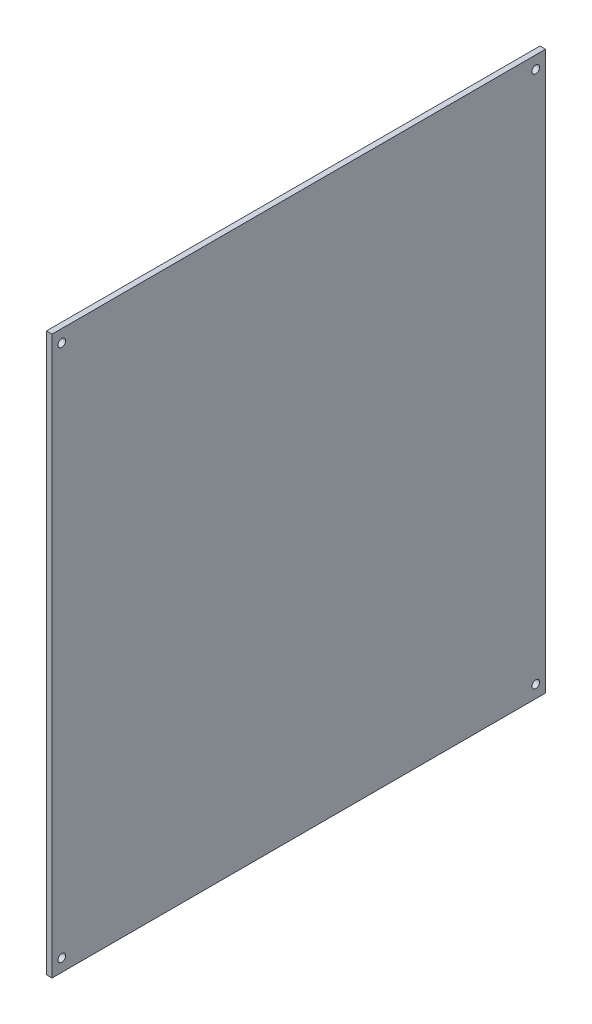
ISO-10303-21;
HEADER;
FILE_DESCRIPTION(('STEP AP214'),'2;1');
FILE_NAME('part.step','',(''),(''),'','','');
FILE_SCHEMA(('AUTOMOTIVE_DESIGN { 1 0 10303 214 1 1 1 1 }'));
ENDSEC;
DATA;
#1=APPLICATION_CONTEXT('core data for automotive mechanical design processes');
#2=APPLICATION_PROTOCOL_DEFINITION('international standard','automotive_design',2000,#1);
#3=PRODUCT_CONTEXT('',#1,'mechanical');
#4=PRODUCT('Part','Part','',(#3));
#5=PRODUCT_RELATED_PRODUCT_CATEGORY('part','',(#4));
#6=PRODUCT_DEFINITION_FORMATION('','',#4);
#7=PRODUCT_DEFINITION_CONTEXT('part definition',#1,'design');
#8=PRODUCT_DEFINITION('design','',#6,#7);
#9=PRODUCT_DEFINITION_SHAPE('','',#8);
#10=(LENGTH_UNIT() NAMED_UNIT(*) SI_UNIT(.MILLI.,.METRE.));
#11=(NAMED_UNIT(*) PLANE_ANGLE_UNIT() SI_UNIT($,.RADIAN.));
#12=(NAMED_UNIT(*) SI_UNIT($,.STERADIAN.) SOLID_ANGLE_UNIT());
#13=UNCERTAINTY_MEASURE_WITH_UNIT(LENGTH_MEASURE(1.E-05),#10,'distance_accuracy_value','');
#14=(GEOMETRIC_REPRESENTATION_CONTEXT(3) GLOBAL_UNCERTAINTY_ASSIGNED_CONTEXT((#13)) GLOBAL_UNIT_ASSIGNED_CONTEXT((#10,
#11,#12)) REPRESENTATION_CONTEXT('',''));
#15=CARTESIAN_POINT('',(0.,0.,0.));
#16=DIRECTION('',(0.,0.,1.));
#17=DIRECTION('',(1.,0.,0.));
#18=AXIS2_PLACEMENT_3D('',#15,#16,#17);
#19=CARTESIAN_POINT('',(4.,0.,0.));
#20=DIRECTION('',(0.,0.,-1.));
#21=DIRECTION('',(-1.,0.,0.));
#22=AXIS2_PLACEMENT_3D('',#19,#20,#21);
#23=PLANE('',#22);
#24=DIRECTION('',(0.,-1.,0.));
#25=VECTOR('',#24,1.);
#26=CARTESIAN_POINT('',(0.,0.,0.));
#27=LINE('',#26,#25);
#28=CARTESIAN_POINT('',(0.,400.,0.));
#29=VERTEX_POINT('',#28);
#30=CARTESIAN_POINT('',(0.,0.,0.));
#31=VERTEX_POINT('',#30);
#32=EDGE_CURVE('E110',#29,#31,#27,.T.);
#33=ORIENTED_EDGE('',*,*,#32,.T.);
#34=DIRECTION('',(-1.,0.,0.));
#35=VECTOR('',#34,1.);
#36=CARTESIAN_POINT('',(4.,0.,0.));
#37=LINE('',#36,#35);
#38=CARTESIAN_POINT('',(4.,0.,0.));
#39=VERTEX_POINT('',#38);
#40=EDGE_CURVE('E11',#39,#31,#37,.T.);
#41=ORIENTED_EDGE('',*,*,#40,.F.);
#42=DIRECTION('',(0.,-1.,0.));
#43=VECTOR('',#42,1.);
#44=CARTESIAN_POINT('',(4.,0.,0.));
#45=LINE('',#44,#43);
#46=CARTESIAN_POINT('',(4.,400.,0.));
#47=VERTEX_POINT('',#46);
#48=EDGE_CURVE('E94',#47,#39,#45,.T.);
#49=ORIENTED_EDGE('',*,*,#48,.F.);
#50=DIRECTION('',(-1.,0.,0.));
#51=VECTOR('',#50,1.);
#52=CARTESIAN_POINT('',(4.,400.,0.));
#53=LINE('',#52,#51);
#54=EDGE_CURVE('E106',#47,#29,#53,.T.);
#55=ORIENTED_EDGE('',*,*,#54,.T.);
#56=EDGE_LOOP('',(#33,#41,#49,#55));
#57=FACE_BOUND('',#56,.T.);
#58=ADVANCED_FACE('F42',(#57),#23,.F.);
#59=CARTESIAN_POINT('',(4.,0.,0.));
#60=DIRECTION('',(0.,1.,0.));
#61=DIRECTION('',(0.,0.,1.));
#62=AXIS2_PLACEMENT_3D('',#59,#60,#61);
#63=PLANE('',#62);
#64=DIRECTION('',(0.,0.,-1.));
#65=VECTOR('',#64,1.);
#66=CARTESIAN_POINT('',(0.,0.,0.));
#67=LINE('',#66,#65);
#68=CARTESIAN_POINT('',(0.,0.,-354.));
#69=VERTEX_POINT('',#68);
#70=EDGE_CURVE('E99',#31,#69,#67,.T.);
#71=ORIENTED_EDGE('',*,*,#70,.T.);
#72=DIRECTION('',(-1.,0.,0.));
#73=VECTOR('',#72,1.);
#74=CARTESIAN_POINT('',(4.,0.,-354.));
#75=LINE('',#74,#73);
#76=CARTESIAN_POINT('',(4.,0.,-354.));
#77=VERTEX_POINT('',#76);
#78=EDGE_CURVE('E51',#77,#69,#75,.T.);
#79=ORIENTED_EDGE('',*,*,#78,.F.);
#80=DIRECTION('',(0.,0.,-1.));
#81=VECTOR('',#80,1.);
#82=CARTESIAN_POINT('',(4.,0.,0.));
#83=LINE('',#82,#81);
#84=EDGE_CURVE('E89',#39,#77,#83,.T.);
#85=ORIENTED_EDGE('',*,*,#84,.F.);
#86=ORIENTED_EDGE('',*,*,#40,.T.);
#87=EDGE_LOOP('',(#71,#79,#85,#86));
#88=FACE_BOUND('',#87,.T.);
#89=ADVANCED_FACE('F98',(#88),#63,.F.);
#90=CARTESIAN_POINT('',(4.,0.,-354.));
#91=DIRECTION('',(0.,0.,1.));
#92=DIRECTION('',(1.,0.,0.));
#93=AXIS2_PLACEMENT_3D('',#90,#91,#92);
#94=PLANE('',#93);
#95=DIRECTION('',(0.,1.,0.));
#96=VECTOR('',#95,1.);
#97=CARTESIAN_POINT('',(0.,0.,-354.));
#98=LINE('',#97,#96);
#99=CARTESIAN_POINT('',(0.,400.,-354.));
#100=VERTEX_POINT('',#99);
#101=EDGE_CURVE('E76',#69,#100,#98,.T.);
#102=ORIENTED_EDGE('',*,*,#101,.T.);
#103=DIRECTION('',(-1.,0.,0.));
#104=VECTOR('',#103,1.);
#105=CARTESIAN_POINT('',(4.,400.,-354.));
#106=LINE('',#105,#104);
#107=CARTESIAN_POINT('',(4.,400.,-354.));
#108=VERTEX_POINT('',#107);
#109=EDGE_CURVE('E101',#108,#100,#106,.T.);
#110=ORIENTED_EDGE('',*,*,#109,.F.);
#111=DIRECTION('',(0.,1.,0.));
#112=VECTOR('',#111,1.);
#113=CARTESIAN_POINT('',(4.,0.,-354.));
#114=LINE('',#113,#112);
#115=EDGE_CURVE('E92',#77,#108,#114,.T.);
#116=ORIENTED_EDGE('',*,*,#115,.F.);
#117=ORIENTED_EDGE('',*,*,#78,.T.);
#118=EDGE_LOOP('',(#102,#110,#116,#117));
#119=FACE_BOUND('',#118,.T.);
#120=ADVANCED_FACE('F102',(#119),#94,.F.);
#121=CARTESIAN_POINT('',(4.,400.,0.));
#122=DIRECTION('',(0.,-1.,0.));
#123=DIRECTION('',(0.,0.,-1.));
#124=AXIS2_PLACEMENT_3D('',#121,#122,#123);
#125=PLANE('',#124);
#126=DIRECTION('',(0.,0.,1.));
#127=VECTOR('',#126,1.);
#128=CARTESIAN_POINT('',(0.,400.,0.));
#129=LINE('',#128,#127);
#130=EDGE_CURVE('E82',#100,#29,#129,.T.);
#131=ORIENTED_EDGE('',*,*,#130,.T.);
#132=ORIENTED_EDGE('',*,*,#54,.F.);
#133=DIRECTION('',(0.,0.,1.));
#134=VECTOR('',#133,1.);
#135=CARTESIAN_POINT('',(4.,400.,0.));
#136=LINE('',#135,#134);
#137=EDGE_CURVE('E59',#108,#47,#136,.T.);
#138=ORIENTED_EDGE('',*,*,#137,.F.);
#139=ORIENTED_EDGE('',*,*,#109,.T.);
#140=EDGE_LOOP('',(#131,#132,#138,#139));
#141=FACE_BOUND('',#140,.T.);
#142=ADVANCED_FACE('F124',(#141),#125,.F.);
#143=CARTESIAN_POINT('',(4.,0.,0.));
#144=DIRECTION('',(-1.,0.,0.));
#145=DIRECTION('',(0.,0.,1.));
#146=AXIS2_PLACEMENT_3D('',#143,#144,#145);
#147=PLANE('',#146);
#148=CARTESIAN_POINT('',(4.,391.,-347.));
#149=DIRECTION('',(1.,0.,0.));
#150=DIRECTION('',(0.,0.,1.));
#151=AXIS2_PLACEMENT_3D('',#148,#149,#150);
#152=CIRCLE('',#151,2.74999999999998);
#153=CARTESIAN_POINT('',(4.,391.,-344.25));
#154=VERTEX_POINT('',#153);
#155=EDGE_CURVE('E143',#154,#154,#152,.T.);
#156=ORIENTED_EDGE('',*,*,#155,.F.);
#157=EDGE_LOOP('',(#156));
#158=FACE_BOUND('',#157,.T.);
#159=CARTESIAN_POINT('',(4.,9.00000000000001,-347.));
#160=DIRECTION('',(1.,0.,0.));
#161=DIRECTION('',(0.,0.,1.));
#162=AXIS2_PLACEMENT_3D('',#159,#160,#161);
#163=CIRCLE('',#162,2.74999999999998);
#164=CARTESIAN_POINT('',(4.,9.00000000000001,-344.25));
#165=VERTEX_POINT('',#164);
#166=EDGE_CURVE('E151',#165,#165,#163,.T.);
#167=ORIENTED_EDGE('',*,*,#166,.F.);
#168=EDGE_LOOP('',(#167));
#169=FACE_BOUND('',#168,.T.);
#170=CARTESIAN_POINT('',(4.,9.00000000000001,-7.));
#171=DIRECTION('',(1.,0.,0.));
#172=DIRECTION('',(0.,0.,-1.));
#173=AXIS2_PLACEMENT_3D('',#170,#171,#172);
#174=CIRCLE('',#173,2.75);
#175=CARTESIAN_POINT('',(4.,9.00000000000001,-9.75));
#176=VERTEX_POINT('',#175);
#177=EDGE_CURVE('E135',#176,#176,#174,.T.);
#178=ORIENTED_EDGE('',*,*,#177,.F.);
#179=EDGE_LOOP('',(#178));
#180=FACE_BOUND('',#179,.T.);
#181=CARTESIAN_POINT('',(4.,391.,-7.));
#182=DIRECTION('',(1.,0.,0.));
#183=DIRECTION('',(0.,0.,-1.));
#184=AXIS2_PLACEMENT_3D('',#181,#182,#183);
#185=CIRCLE('',#184,2.75);
#186=CARTESIAN_POINT('',(4.,391.,-9.75));
#187=VERTEX_POINT('',#186);
#188=EDGE_CURVE('E131',#187,#187,#185,.T.);
#189=ORIENTED_EDGE('',*,*,#188,.F.);
#190=EDGE_LOOP('',(#189));
#191=FACE_BOUND('',#190,.T.);
#192=ORIENTED_EDGE('',*,*,#48,.T.);
#193=ORIENTED_EDGE('',*,*,#84,.T.);
#194=ORIENTED_EDGE('',*,*,#115,.T.);
#195=ORIENTED_EDGE('',*,*,#137,.T.);
#196=EDGE_LOOP('',(#192,#193,#194,#195));
#197=FACE_BOUND('',#196,.T.);
#198=ADVANCED_FACE('F90',(#158,#169,#180,#191,#197),#147,.F.);
#199=CARTESIAN_POINT('',(0.,0.,0.));
#200=DIRECTION('',(-1.,0.,0.));
#201=DIRECTION('',(0.,0.,1.));
#202=AXIS2_PLACEMENT_3D('',#199,#200,#201);
#203=PLANE('',#202);
#204=CARTESIAN_POINT('',(0.,391.,-347.));
#205=DIRECTION('',(1.,0.,0.));
#206=DIRECTION('',(0.,0.,1.));
#207=AXIS2_PLACEMENT_3D('',#204,#205,#206);
#208=CIRCLE('',#207,2.74999999999998);
#209=CARTESIAN_POINT('',(0.,391.,-344.25));
#210=VERTEX_POINT('',#209);
#211=EDGE_CURVE('E139',#210,#210,#208,.T.);
#212=ORIENTED_EDGE('',*,*,#211,.T.);
#213=EDGE_LOOP('',(#212));
#214=FACE_BOUND('',#213,.T.);
#215=CARTESIAN_POINT('',(0.,9.00000000000001,-347.));
#216=DIRECTION('',(1.,0.,0.));
#217=DIRECTION('',(0.,0.,1.));
#218=AXIS2_PLACEMENT_3D('',#215,#216,#217);
#219=CIRCLE('',#218,2.74999999999998);
#220=CARTESIAN_POINT('',(0.,9.00000000000001,-344.25));
#221=VERTEX_POINT('',#220);
#222=EDGE_CURVE('E147',#221,#221,#219,.T.);
#223=ORIENTED_EDGE('',*,*,#222,.T.);
#224=EDGE_LOOP('',(#223));
#225=FACE_BOUND('',#224,.T.);
#226=CARTESIAN_POINT('',(0.,9.00000000000001,-7.));
#227=DIRECTION('',(1.,0.,0.));
#228=DIRECTION('',(0.,0.,-1.));
#229=AXIS2_PLACEMENT_3D('',#226,#227,#228);
#230=CIRCLE('',#229,2.75);
#231=CARTESIAN_POINT('',(0.,9.00000000000001,-9.75));
#232=VERTEX_POINT('',#231);
#233=EDGE_CURVE('E155',#232,#232,#230,.T.);
#234=ORIENTED_EDGE('',*,*,#233,.T.);
#235=EDGE_LOOP('',(#234));
#236=FACE_BOUND('',#235,.T.);
#237=CARTESIAN_POINT('',(0.,391.,-7.));
#238=DIRECTION('',(1.,0.,0.));
#239=DIRECTION('',(0.,0.,-1.));
#240=AXIS2_PLACEMENT_3D('',#237,#238,#239);
#241=CIRCLE('',#240,2.75);
#242=CARTESIAN_POINT('',(0.,391.,-9.75));
#243=VERTEX_POINT('',#242);
#244=EDGE_CURVE('E114',#243,#243,#241,.T.);
#245=ORIENTED_EDGE('',*,*,#244,.T.);
#246=EDGE_LOOP('',(#245));
#247=FACE_BOUND('',#246,.T.);
#248=ORIENTED_EDGE('',*,*,#32,.F.);
#249=ORIENTED_EDGE('',*,*,#130,.F.);
#250=ORIENTED_EDGE('',*,*,#101,.F.);
#251=ORIENTED_EDGE('',*,*,#70,.F.);
#252=EDGE_LOOP('',(#248,#249,#250,#251));
#253=FACE_BOUND('',#252,.T.);
#254=ADVANCED_FACE('F127',(#214,#225,#236,#247,#253),#203,.T.);
#255=CARTESIAN_POINT('',(0.,391.,-7.));
#256=DIRECTION('',(1.,0.,0.));
#257=DIRECTION('',(0.,0.,-1.));
#258=AXIS2_PLACEMENT_3D('',#255,#256,#257);
#259=CYLINDRICAL_SURFACE('',#258,2.75);
#260=ORIENTED_EDGE('',*,*,#244,.F.);
#261=EDGE_LOOP('',(#260));
#262=FACE_BOUND('',#261,.T.);
#263=ORIENTED_EDGE('',*,*,#188,.T.);
#264=EDGE_LOOP('',(#263));
#265=FACE_BOUND('',#264,.T.);
#266=ADVANCED_FACE('F171',(#262,#265),#259,.F.);
#267=CARTESIAN_POINT('',(0.,9.00000000000001,-7.));
#268=DIRECTION('',(1.,0.,0.));
#269=DIRECTION('',(0.,0.,-1.));
#270=AXIS2_PLACEMENT_3D('',#267,#268,#269);
#271=CYLINDRICAL_SURFACE('',#270,2.75);
#272=ORIENTED_EDGE('',*,*,#233,.F.);
#273=EDGE_LOOP('',(#272));
#274=FACE_BOUND('',#273,.T.);
#275=ORIENTED_EDGE('',*,*,#177,.T.);
#276=EDGE_LOOP('',(#275));
#277=FACE_BOUND('',#276,.T.);
#278=ADVANCED_FACE('F163',(#274,#277),#271,.F.);
#279=CARTESIAN_POINT('',(0.,9.00000000000001,-347.));
#280=DIRECTION('',(1.,0.,0.));
#281=DIRECTION('',(0.,0.,-1.));
#282=AXIS2_PLACEMENT_3D('',#279,#280,#281);
#283=CYLINDRICAL_SURFACE('',#282,2.74999999999998);
#284=ORIENTED_EDGE('',*,*,#222,.F.);
#285=EDGE_LOOP('',(#284));
#286=FACE_BOUND('',#285,.T.);
#287=ORIENTED_EDGE('',*,*,#166,.T.);
#288=EDGE_LOOP('',(#287));
#289=FACE_BOUND('',#288,.T.);
#290=ADVANCED_FACE('F179',(#286,#289),#283,.F.);
#291=CARTESIAN_POINT('',(0.,391.,-347.));
#292=DIRECTION('',(1.,0.,0.));
#293=DIRECTION('',(0.,0.,-1.));
#294=AXIS2_PLACEMENT_3D('',#291,#292,#293);
#295=CYLINDRICAL_SURFACE('',#294,2.74999999999998);
#296=ORIENTED_EDGE('',*,*,#211,.F.);
#297=EDGE_LOOP('',(#296));
#298=FACE_BOUND('',#297,.T.);
#299=ORIENTED_EDGE('',*,*,#155,.T.);
#300=EDGE_LOOP('',(#299));
#301=FACE_BOUND('',#300,.T.);
#302=ADVANCED_FACE('F230',(#298,#301),#295,.F.);
#303=CLOSED_SHELL('',(#58,#89,#120,#142,#198,#254,#266,#278,#290,#302));
#304=MANIFOLD_SOLID_BREP('B2',#303);
#305=ADVANCED_BREP_SHAPE_REPRESENTATION('',(#18,#304),#14);
#306=SHAPE_DEFINITION_REPRESENTATION(#9,#305);
ENDSEC;
END-ISO-10303-21;
